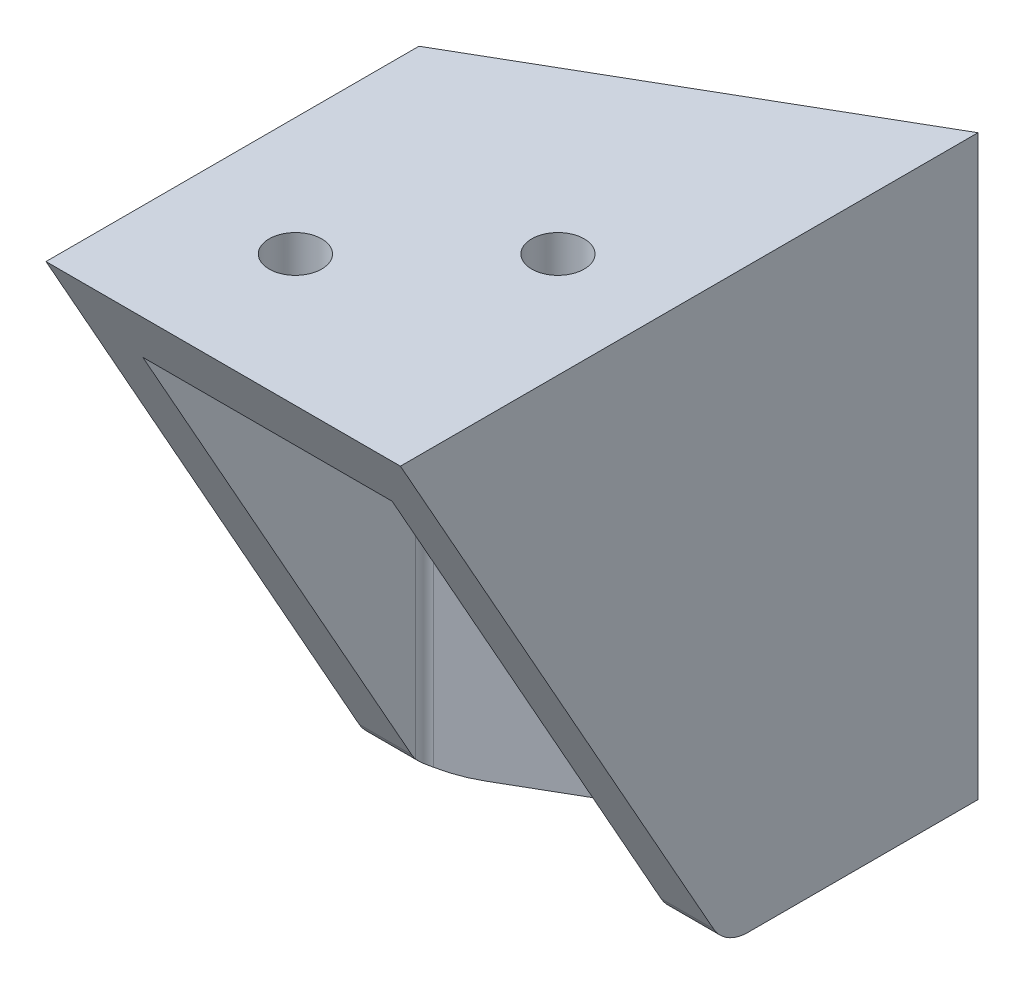
ISO-10303-21;
HEADER;
FILE_DESCRIPTION(('STEP AP214'),'2;1');
FILE_NAME('part.step','',(''),(''),'','','');
FILE_SCHEMA(('AUTOMOTIVE_DESIGN { 1 0 10303 214 1 1 1 1 }'));
ENDSEC;
DATA;
#1=APPLICATION_CONTEXT('core data for automotive mechanical design processes');
#2=APPLICATION_PROTOCOL_DEFINITION('international standard','automotive_design',2000,#1);
#3=PRODUCT_CONTEXT('',#1,'mechanical');
#4=PRODUCT('Part','Part','',(#3));
#5=PRODUCT_RELATED_PRODUCT_CATEGORY('part','',(#4));
#6=PRODUCT_DEFINITION_FORMATION('','',#4);
#7=PRODUCT_DEFINITION_CONTEXT('part definition',#1,'design');
#8=PRODUCT_DEFINITION('design','',#6,#7);
#9=PRODUCT_DEFINITION_SHAPE('','',#8);
#10=(LENGTH_UNIT() NAMED_UNIT(*) SI_UNIT(.MILLI.,.METRE.));
#11=(NAMED_UNIT(*) PLANE_ANGLE_UNIT() SI_UNIT($,.RADIAN.));
#12=(NAMED_UNIT(*) SI_UNIT($,.STERADIAN.) SOLID_ANGLE_UNIT());
#13=UNCERTAINTY_MEASURE_WITH_UNIT(LENGTH_MEASURE(1.E-05),#10,'distance_accuracy_value','');
#14=(GEOMETRIC_REPRESENTATION_CONTEXT(3) GLOBAL_UNCERTAINTY_ASSIGNED_CONTEXT((#13)) GLOBAL_UNIT_ASSIGNED_CONTEXT((#10,
#11,#12)) REPRESENTATION_CONTEXT('',''));
#15=CARTESIAN_POINT('',(0.,0.,0.));
#16=DIRECTION('',(0.,0.,1.));
#17=DIRECTION('',(1.,0.,0.));
#18=AXIS2_PLACEMENT_3D('',#15,#16,#17);
#19=CARTESIAN_POINT('',(0.,0.,0.));
#20=DIRECTION('',(0.,-1.,0.));
#21=DIRECTION('',(0.,0.,-1.));
#22=AXIS2_PLACEMENT_3D('',#19,#20,#21);
#23=PLANE('',#22);
#24=DIRECTION('',(0.,0.,-1.));
#25=VECTOR('',#24,1.);
#26=CARTESIAN_POINT('',(-9.5,0.,-2.72094380863878));
#27=LINE('',#26,#25);
#28=CARTESIAN_POINT('',(-9.5,0.,18.6288805365618));
#29=VERTEX_POINT('',#28);
#30=CARTESIAN_POINT('',(-9.5,0.,-2.14359353944915));
#31=VERTEX_POINT('',#30);
#32=EDGE_CURVE('E372',#29,#31,#27,.T.);
#33=ORIENTED_EDGE('',*,*,#32,.T.);
#34=CARTESIAN_POINT('',(-8.5,0.,-2.14359353944915));
#35=DIRECTION('',(0.,-1.,0.));
#36=DIRECTION('',(0.,0.,-1.));
#37=AXIS2_PLACEMENT_3D('',#34,#35,#36);
#38=CIRCLE('',#37,1.);
#39=CARTESIAN_POINT('',(-9.,0.,-3.00961894323359));
#40=VERTEX_POINT('',#39);
#41=EDGE_CURVE('E432',#31,#40,#38,.T.);
#42=ORIENTED_EDGE('',*,*,#41,.T.);
#43=DIRECTION('',(-0.866025403784442,0.,0.499999999999995));
#44=VECTOR('',#43,1.);
#45=CARTESIAN_POINT('',(-3.55320323027553,0.,-6.15432852445516));
#46=LINE('',#45,#44);
#47=CARTESIAN_POINT('',(8.00000000000001,0.,-12.8245735194571));
#48=VERTEX_POINT('',#47);
#49=EDGE_CURVE('E183',#48,#40,#46,.T.);
#50=ORIENTED_EDGE('',*,*,#49,.F.);
#51=CARTESIAN_POINT('',(8.5,0.,-11.9585481156727));
#52=DIRECTION('',(0.,-1.,0.));
#53=DIRECTION('',(0.,0.,-1.));
#54=AXIS2_PLACEMENT_3D('',#51,#52,#53);
#55=CIRCLE('',#54,1.);
#56=CARTESIAN_POINT('',(9.5,0.,-11.9585481156727));
#57=VERTEX_POINT('',#56);
#58=EDGE_CURVE('E202',#48,#57,#55,.T.);
#59=ORIENTED_EDGE('',*,*,#58,.T.);
#60=DIRECTION('',(0.,0.,1.));
#61=VECTOR('',#60,1.);
#62=CARTESIAN_POINT('',(9.5,0.,22.));
#63=LINE('',#62,#61);
#64=CARTESIAN_POINT('',(9.5,0.,18.6288805365618));
#65=VERTEX_POINT('',#64);
#66=EDGE_CURVE('E203',#57,#65,#63,.T.);
#67=ORIENTED_EDGE('',*,*,#66,.T.);
#68=DIRECTION('',(1.,0.,0.));
#69=VECTOR('',#68,1.);
#70=CARTESIAN_POINT('',(0.,0.,18.6288805365618));
#71=LINE('',#70,#69);
#72=EDGE_CURVE('E170',#29,#65,#71,.T.);
#73=ORIENTED_EDGE('',*,*,#72,.F.);
#74=EDGE_LOOP('',(#33,#42,#50,#59,#67,#73));
#75=FACE_BOUND('',#74,.T.);
#76=CARTESIAN_POINT('',(-4.5,0.,12.));
#77=DIRECTION('',(0.,-1.,0.));
#78=DIRECTION('',(0.,0.,-1.));
#79=AXIS2_PLACEMENT_3D('',#76,#77,#78);
#80=CIRCLE('',#79,2.);
#81=CARTESIAN_POINT('',(-4.5,0.,10.));
#82=VERTEX_POINT('',#81);
#83=EDGE_CURVE('E330',#82,#82,#80,.T.);
#84=ORIENTED_EDGE('',*,*,#83,.F.);
#85=EDGE_LOOP('',(#84));
#86=FACE_BOUND('',#85,.T.);
#87=CARTESIAN_POINT('',(5.5,0.,2.));
#88=DIRECTION('',(0.,-1.,0.));
#89=DIRECTION('',(0.,0.,-1.));
#90=AXIS2_PLACEMENT_3D('',#87,#88,#89);
#91=CIRCLE('',#90,2.);
#92=CARTESIAN_POINT('',(5.5,0.,0.));
#93=VERTEX_POINT('',#92);
#94=EDGE_CURVE('E332',#93,#93,#91,.T.);
#95=ORIENTED_EDGE('',*,*,#94,.F.);
#96=EDGE_LOOP('',(#95));
#97=FACE_BOUND('',#96,.T.);
#98=ADVANCED_FACE('F56',(#75,#86,#97),#23,.T.);
#99=CARTESIAN_POINT('',(13.5,-38.,-16.));
#100=DIRECTION('',(0.499999999999995,0.,0.866025403784442));
#101=DIRECTION('',(0.866025403784442,0.,-0.499999999999995));
#102=AXIS2_PLACEMENT_3D('',#99,#100,#101);
#103=PLANE('',#102);
#104=DIRECTION('',(0.,-1.,0.));
#105=VECTOR('',#104,1.);
#106=CARTESIAN_POINT('',(-9.,-37.9989340219212,-3.00961894323359));
#107=LINE('',#106,#105);
#108=CARTESIAN_POINT('',(-9.,-37.6165958429926,-3.00961894323359));
#109=VERTEX_POINT('',#108);
#110=EDGE_CURVE('E198',#40,#109,#107,.T.);
#111=ORIENTED_EDGE('',*,*,#110,.T.);
#112=CARTESIAN_POINT('',(-6.45829219159598,-35.,-4.47707463061701));
#113=DIRECTION('',(0.499999999999995,0.,0.866025403784442));
#114=DIRECTION('',(0.866025403784442,0.,-0.499999999999995));
#115=AXIS2_PLACEMENT_3D('',#112,#113,#114);
#116=ELLIPSE('',#115,6.00000000000006,3.);
#117=CARTESIAN_POINT('',(-6.45829219159598,-38.,-4.47707463061701));
#118=VERTEX_POINT('',#117);
#119=EDGE_CURVE('E409',#109,#118,#116,.T.);
#120=ORIENTED_EDGE('',*,*,#119,.T.);
#121=DIRECTION('',(0.866025403784441,0.,-0.499999999999995));
#122=VECTOR('',#121,1.);
#123=CARTESIAN_POINT('',(13.5,-38.,-16.));
#124=LINE('',#123,#122);
#125=CARTESIAN_POINT('',(8.00000000000001,-38.,-12.8245735194571));
#126=VERTEX_POINT('',#125);
#127=EDGE_CURVE('E287',#118,#126,#124,.T.);
#128=ORIENTED_EDGE('',*,*,#127,.T.);
#129=DIRECTION('',(0.,1.,0.));
#130=VECTOR('',#129,1.);
#131=CARTESIAN_POINT('',(8.00000000000001,-38.,-12.8245735194571));
#132=LINE('',#131,#130);
#133=EDGE_CURVE('E195',#126,#48,#132,.T.);
#134=ORIENTED_EDGE('',*,*,#133,.T.);
#135=ORIENTED_EDGE('',*,*,#49,.T.);
#136=EDGE_LOOP('',(#111,#120,#128,#134,#135));
#137=FACE_BOUND('',#136,.T.);
#138=CARTESIAN_POINT('',(1.22243186433548,-13.,-8.91154273188021));
#139=DIRECTION('',(0.499999999999995,0.,0.866025403784442));
#140=DIRECTION('',(0.866025403784442,0.,-0.499999999999995));
#141=AXIS2_PLACEMENT_3D('',#138,#139,#140);
#142=CIRCLE('',#141,2.05);
#143=CARTESIAN_POINT('',(2.99778394209358,-13.,-9.9365427318802));
#144=VERTEX_POINT('',#143);
#145=EDGE_CURVE('E341',#144,#144,#142,.T.);
#146=ORIENTED_EDGE('',*,*,#145,.F.);
#147=EDGE_LOOP('',(#146));
#148=FACE_BOUND('',#147,.T.);
#149=CARTESIAN_POINT('',(-3.10769515458673,-25.5,-6.41154273188023));
#150=DIRECTION('',(0.499999999999995,0.,0.866025403784442));
#151=DIRECTION('',(0.866025403784442,0.,-0.499999999999995));
#152=AXIS2_PLACEMENT_3D('',#149,#150,#151);
#153=CIRCLE('',#152,2.05);
#154=CARTESIAN_POINT('',(-1.33234307682862,-25.5,-7.43654273188022));
#155=VERTEX_POINT('',#154);
#156=EDGE_CURVE('E186',#155,#155,#153,.T.);
#157=ORIENTED_EDGE('',*,*,#156,.F.);
#158=EDGE_LOOP('',(#157));
#159=FACE_BOUND('',#158,.T.);
#160=ADVANCED_FACE('F236',(#137,#148,#159),#103,.T.);
#161=CARTESIAN_POINT('',(13.5,6.,22.));
#162=DIRECTION('',(-1.,0.,0.));
#163=DIRECTION('',(0.,0.,1.));
#164=AXIS2_PLACEMENT_3D('',#161,#162,#163);
#165=PLANE('',#164);
#166=DIRECTION('',(0.,-0.871816365902067,-0.48983285327274));
#167=VECTOR('',#166,1.);
#168=CARTESIAN_POINT('',(13.5,6.,22.));
#169=LINE('',#168,#167);
#170=CARTESIAN_POINT('',(13.5,6.,22.));
#171=VERTEX_POINT('',#170);
#172=CARTESIAN_POINT('',(13.5,-36.4694985598182,-1.8616255329108));
#173=VERTEX_POINT('',#172);
#174=EDGE_CURVE('E158',#171,#173,#169,.T.);
#175=ORIENTED_EDGE('',*,*,#174,.T.);
#176=CARTESIAN_POINT('',(13.5,-35.,-4.47707463061701));
#177=DIRECTION('',(-1.,0.,0.));
#178=DIRECTION('',(0.,0.,1.));
#179=AXIS2_PLACEMENT_3D('',#176,#177,#178);
#180=CIRCLE('',#179,3.);
#181=CARTESIAN_POINT('',(13.5,-38.,-4.47707463061701));
#182=VERTEX_POINT('',#181);
#183=EDGE_CURVE('E12',#173,#182,#180,.F.);
#184=ORIENTED_EDGE('',*,*,#183,.T.);
#185=DIRECTION('',(0.,0.,-1.));
#186=VECTOR('',#185,1.);
#187=CARTESIAN_POINT('',(13.5,-38.,22.));
#188=LINE('',#187,#186);
#189=CARTESIAN_POINT('',(13.5,-38.,-16.));
#190=VERTEX_POINT('',#189);
#191=EDGE_CURVE('E60',#182,#190,#188,.T.);
#192=ORIENTED_EDGE('',*,*,#191,.T.);
#193=DIRECTION('',(0.,0.,-1.));
#194=VECTOR('',#193,1.);
#195=CARTESIAN_POINT('',(13.5,-38.,-22.));
#196=LINE('',#195,#194);
#197=CARTESIAN_POINT('',(13.5,-38.,-22.));
#198=VERTEX_POINT('',#197);
#199=EDGE_CURVE('E347',#190,#198,#196,.T.);
#200=ORIENTED_EDGE('',*,*,#199,.T.);
#201=DIRECTION('',(0.,-1.,0.));
#202=VECTOR('',#201,1.);
#203=CARTESIAN_POINT('',(13.5,6.,-22.));
#204=LINE('',#203,#202);
#205=CARTESIAN_POINT('',(13.5,6.,-22.));
#206=VERTEX_POINT('',#205);
#207=EDGE_CURVE('E162',#206,#198,#204,.T.);
#208=ORIENTED_EDGE('',*,*,#207,.F.);
#209=DIRECTION('',(0.,0.,-1.));
#210=VECTOR('',#209,1.);
#211=CARTESIAN_POINT('',(13.5,6.,22.));
#212=LINE('',#211,#210);
#213=EDGE_CURVE('E176',#171,#206,#212,.T.);
#214=ORIENTED_EDGE('',*,*,#213,.F.);
#215=EDGE_LOOP('',(#175,#184,#192,#200,#208,#214));
#216=FACE_BOUND('',#215,.T.);
#217=ADVANCED_FACE('F240',(#216),#165,.F.);
#218=CARTESIAN_POINT('',(-13.5,6.,22.));
#219=DIRECTION('',(1.,0.,0.));
#220=DIRECTION('',(0.,0.,-1.));
#221=AXIS2_PLACEMENT_3D('',#218,#219,#220);
#222=PLANE('',#221);
#223=DIRECTION('',(0.,0.,1.));
#224=VECTOR('',#223,1.);
#225=CARTESIAN_POINT('',(-13.5,-38.,-0.411542731880311));
#226=LINE('',#225,#224);
#227=CARTESIAN_POINT('',(-13.5,-38.,-6.41154273188031));
#228=VERTEX_POINT('',#227);
#229=CARTESIAN_POINT('',(-13.5,-38.,-4.47707463061701));
#230=VERTEX_POINT('',#229);
#231=EDGE_CURVE('E263',#228,#230,#226,.T.);
#232=ORIENTED_EDGE('',*,*,#231,.T.);
#233=CARTESIAN_POINT('',(-13.5,-35.,-4.47707463061701));
#234=DIRECTION('',(1.,0.,0.));
#235=DIRECTION('',(0.,0.,-1.));
#236=AXIS2_PLACEMENT_3D('',#233,#234,#235);
#237=CIRCLE('',#236,3.);
#238=CARTESIAN_POINT('',(-13.5,-36.4694985598182,-1.8616255329108));
#239=VERTEX_POINT('',#238);
#240=EDGE_CURVE('E169',#230,#239,#237,.F.);
#241=ORIENTED_EDGE('',*,*,#240,.T.);
#242=DIRECTION('',(0.,-0.871816365902067,-0.48983285327274));
#243=VECTOR('',#242,1.);
#244=CARTESIAN_POINT('',(-13.5,6.,22.));
#245=LINE('',#244,#243);
#246=CARTESIAN_POINT('',(-13.5,6.,22.));
#247=VERTEX_POINT('',#246);
#248=EDGE_CURVE('E155',#247,#239,#245,.T.);
#249=ORIENTED_EDGE('',*,*,#248,.F.);
#250=DIRECTION('',(0.,0.,1.));
#251=VECTOR('',#250,1.);
#252=CARTESIAN_POINT('',(-13.5,6.,22.));
#253=LINE('',#252,#251);
#254=CARTESIAN_POINT('',(-13.5,6.,-6.41154273188031));
#255=VERTEX_POINT('',#254);
#256=EDGE_CURVE('E163',#255,#247,#253,.T.);
#257=ORIENTED_EDGE('',*,*,#256,.F.);
#258=DIRECTION('',(0.,1.,0.));
#259=VECTOR('',#258,1.);
#260=CARTESIAN_POINT('',(-13.5,0.,-6.41154273188031));
#261=LINE('',#260,#259);
#262=EDGE_CURVE('E178',#228,#255,#261,.T.);
#263=ORIENTED_EDGE('',*,*,#262,.F.);
#264=EDGE_LOOP('',(#232,#241,#249,#257,#263));
#265=FACE_BOUND('',#264,.T.);
#266=ADVANCED_FACE('F168',(#265),#222,.F.);
#267=CARTESIAN_POINT('',(0.,6.,0.));
#268=DIRECTION('',(0.,-1.,0.));
#269=DIRECTION('',(0.,0.,-1.));
#270=AXIS2_PLACEMENT_3D('',#267,#268,#269);
#271=PLANE('',#270);
#272=CARTESIAN_POINT('',(-4.5,6.,12.));
#273=DIRECTION('',(0.,-1.,0.));
#274=DIRECTION('',(0.,0.,-1.));
#275=AXIS2_PLACEMENT_3D('',#272,#273,#274);
#276=CIRCLE('',#275,2.);
#277=CARTESIAN_POINT('',(-4.5,6.,10.));
#278=VERTEX_POINT('',#277);
#279=EDGE_CURVE('E327',#278,#278,#276,.T.);
#280=ORIENTED_EDGE('',*,*,#279,.T.);
#281=EDGE_LOOP('',(#280));
#282=FACE_BOUND('',#281,.T.);
#283=CARTESIAN_POINT('',(5.5,6.,2.));
#284=DIRECTION('',(0.,-1.,0.));
#285=DIRECTION('',(0.,0.,-1.));
#286=AXIS2_PLACEMENT_3D('',#283,#284,#285);
#287=CIRCLE('',#286,2.);
#288=CARTESIAN_POINT('',(5.5,6.,0.));
#289=VERTEX_POINT('',#288);
#290=EDGE_CURVE('E336',#289,#289,#287,.T.);
#291=ORIENTED_EDGE('',*,*,#290,.T.);
#292=EDGE_LOOP('',(#291));
#293=FACE_BOUND('',#292,.T.);
#294=ORIENTED_EDGE('',*,*,#213,.T.);
#295=DIRECTION('',(0.866025403784441,0.,-0.499999999999995));
#296=VECTOR('',#295,1.);
#297=CARTESIAN_POINT('',(13.5,6.,-22.));
#298=LINE('',#297,#296);
#299=EDGE_CURVE('E175',#255,#206,#298,.T.);
#300=ORIENTED_EDGE('',*,*,#299,.F.);
#301=ORIENTED_EDGE('',*,*,#256,.T.);
#302=DIRECTION('',(1.,0.,0.));
#303=VECTOR('',#302,1.);
#304=CARTESIAN_POINT('',(-13.5,6.,22.));
#305=LINE('',#304,#303);
#306=EDGE_CURVE('E152',#247,#171,#305,.T.);
#307=ORIENTED_EDGE('',*,*,#306,.T.);
#308=EDGE_LOOP('',(#294,#300,#301,#307));
#309=FACE_BOUND('',#308,.T.);
#310=ADVANCED_FACE('F173',(#282,#293,#309),#271,.F.);
#311=CARTESIAN_POINT('',(13.5,0.,-22.));
#312=DIRECTION('',(0.499999999999995,0.,0.866025403784442));
#313=DIRECTION('',(0.866025403784442,0.,-0.499999999999995));
#314=AXIS2_PLACEMENT_3D('',#311,#312,#313);
#315=PLANE('',#314);
#316=CARTESIAN_POINT('',(-1.37564434701782,-13.,-13.4115427318802));
#317=DIRECTION('',(-0.499999999999995,0.,-0.866025403784442));
#318=DIRECTION('',(-0.866025403784442,0.,0.499999999999995));
#319=AXIS2_PLACEMENT_3D('',#316,#317,#318);
#320=CIRCLE('',#319,2.05);
#321=CARTESIAN_POINT('',(-3.15099642477593,-13.,-12.3865427318803));
#322=VERTEX_POINT('',#321);
#323=EDGE_CURVE('E359',#322,#322,#320,.T.);
#324=ORIENTED_EDGE('',*,*,#323,.F.);
#325=EDGE_LOOP('',(#324));
#326=FACE_BOUND('',#325,.T.);
#327=CARTESIAN_POINT('',(-5.70577136594003,-25.5,-10.9115427318803));
#328=DIRECTION('',(-0.499999999999995,0.,-0.866025403784442));
#329=DIRECTION('',(-0.866025403784442,0.,0.499999999999995));
#330=AXIS2_PLACEMENT_3D('',#327,#328,#329);
#331=CIRCLE('',#330,2.05);
#332=CARTESIAN_POINT('',(-7.48112344369814,-25.5,-9.88654273188028));
#333=VERTEX_POINT('',#332);
#334=EDGE_CURVE('E362',#333,#333,#331,.T.);
#335=ORIENTED_EDGE('',*,*,#334,.F.);
#336=EDGE_LOOP('',(#335));
#337=FACE_BOUND('',#336,.T.);
#338=ORIENTED_EDGE('',*,*,#299,.T.);
#339=ORIENTED_EDGE('',*,*,#207,.T.);
#340=DIRECTION('',(-0.866025403784441,0.,0.499999999999995));
#341=VECTOR('',#340,1.);
#342=CARTESIAN_POINT('',(-13.5,-38.,-6.41154273188031));
#343=LINE('',#342,#341);
#344=EDGE_CURVE('E344',#198,#228,#343,.T.);
#345=ORIENTED_EDGE('',*,*,#344,.T.);
#346=ORIENTED_EDGE('',*,*,#262,.T.);
#347=EDGE_LOOP('',(#338,#339,#345,#346));
#348=FACE_BOUND('',#347,.T.);
#349=ADVANCED_FACE('F233',(#326,#337,#348),#315,.F.);
#350=CARTESIAN_POINT('',(0.,-38.,0.));
#351=DIRECTION('',(0.,-1.,0.));
#352=DIRECTION('',(0.,0.,-1.));
#353=AXIS2_PLACEMENT_3D('',#350,#351,#352);
#354=PLANE('',#353);
#355=ORIENTED_EDGE('',*,*,#127,.F.);
#356=DIRECTION('',(-1.,0.,0.));
#357=VECTOR('',#356,1.);
#358=CARTESIAN_POINT('',(-13.5,-38.,-4.47707463061701));
#359=LINE('',#358,#357);
#360=EDGE_CURVE('E355',#118,#230,#359,.T.);
#361=ORIENTED_EDGE('',*,*,#360,.T.);
#362=ORIENTED_EDGE('',*,*,#231,.F.);
#363=ORIENTED_EDGE('',*,*,#344,.F.);
#364=ORIENTED_EDGE('',*,*,#199,.F.);
#365=ORIENTED_EDGE('',*,*,#191,.F.);
#366=DIRECTION('',(-1.,0.,0.));
#367=VECTOR('',#366,1.);
#368=CARTESIAN_POINT('',(9.5,-38.,-4.47707463061701));
#369=LINE('',#368,#367);
#370=CARTESIAN_POINT('',(9.5,-38.,-4.47707463061701));
#371=VERTEX_POINT('',#370);
#372=EDGE_CURVE('E378',#182,#371,#369,.T.);
#373=ORIENTED_EDGE('',*,*,#372,.T.);
#374=DIRECTION('',(0.,0.,-1.));
#375=VECTOR('',#374,1.);
#376=CARTESIAN_POINT('',(9.5,-38.,22.));
#377=LINE('',#376,#375);
#378=CARTESIAN_POINT('',(9.5,-38.,-11.9585481156727));
#379=VERTEX_POINT('',#378);
#380=EDGE_CURVE('E207',#371,#379,#377,.T.);
#381=ORIENTED_EDGE('',*,*,#380,.T.);
#382=CARTESIAN_POINT('',(8.5,-38.,-11.9585481156727));
#383=DIRECTION('',(0.,-1.,0.));
#384=DIRECTION('',(0.,0.,-1.));
#385=AXIS2_PLACEMENT_3D('',#382,#383,#384);
#386=CIRCLE('',#385,1.);
#387=EDGE_CURVE('E379',#379,#126,#386,.F.);
#388=ORIENTED_EDGE('',*,*,#387,.T.);
#389=EDGE_LOOP('',(#355,#361,#362,#363,#364,#365,#373,#381,#388));
#390=FACE_BOUND('',#389,.T.);
#391=ADVANCED_FACE('F222',(#390),#354,.T.);
#392=CARTESIAN_POINT('',(5.5,6.,2.));
#393=DIRECTION('',(0.,-1.,0.));
#394=DIRECTION('',(0.,0.,-1.));
#395=AXIS2_PLACEMENT_3D('',#392,#393,#394);
#396=CYLINDRICAL_SURFACE('',#395,2.);
#397=ORIENTED_EDGE('',*,*,#290,.F.);
#398=EDGE_LOOP('',(#397));
#399=FACE_BOUND('',#398,.T.);
#400=ORIENTED_EDGE('',*,*,#94,.T.);
#401=EDGE_LOOP('',(#400));
#402=FACE_BOUND('',#401,.T.);
#403=ADVANCED_FACE('F232',(#399,#402),#396,.F.);
#404=CARTESIAN_POINT('',(-4.5,6.,12.));
#405=DIRECTION('',(0.,-1.,0.));
#406=DIRECTION('',(0.,0.,-1.));
#407=AXIS2_PLACEMENT_3D('',#404,#405,#406);
#408=CYLINDRICAL_SURFACE('',#407,2.);
#409=ORIENTED_EDGE('',*,*,#279,.F.);
#410=EDGE_LOOP('',(#409));
#411=FACE_BOUND('',#410,.T.);
#412=ORIENTED_EDGE('',*,*,#83,.T.);
#413=EDGE_LOOP('',(#412));
#414=FACE_BOUND('',#413,.T.);
#415=ADVANCED_FACE('F316',(#411,#414),#408,.F.);
#416=CARTESIAN_POINT('',(13.3467875173175,-25.5,22.08845726812));
#417=DIRECTION('',(-0.499999999999995,0.,-0.866025403784441));
#418=DIRECTION('',(-0.866025403784442,0.,0.499999999999995));
#419=AXIS2_PLACEMENT_3D('',#416,#417,#418);
#420=CYLINDRICAL_SURFACE('',#419,2.05);
#421=ORIENTED_EDGE('',*,*,#156,.T.);
#422=EDGE_LOOP('',(#421));
#423=FACE_BOUND('',#422,.T.);
#424=ORIENTED_EDGE('',*,*,#334,.T.);
#425=EDGE_LOOP('',(#424));
#426=FACE_BOUND('',#425,.T.);
#427=ADVANCED_FACE('F313',(#423,#426),#420,.F.);
#428=CARTESIAN_POINT('',(17.6769145362397,-13.,19.58845726812));
#429=DIRECTION('',(-0.499999999999995,0.,-0.866025403784441));
#430=DIRECTION('',(-0.866025403784442,0.,0.499999999999995));
#431=AXIS2_PLACEMENT_3D('',#428,#429,#430);
#432=CYLINDRICAL_SURFACE('',#431,2.05);
#433=ORIENTED_EDGE('',*,*,#145,.T.);
#434=EDGE_LOOP('',(#433));
#435=FACE_BOUND('',#434,.T.);
#436=ORIENTED_EDGE('',*,*,#323,.T.);
#437=EDGE_LOOP('',(#436));
#438=FACE_BOUND('',#437,.T.);
#439=ADVANCED_FACE('F309',(#435,#438),#432,.F.);
#440=CARTESIAN_POINT('',(9.5,0.,0.));
#441=DIRECTION('',(1.,0.,0.));
#442=DIRECTION('',(0.,0.,-1.));
#443=AXIS2_PLACEMENT_3D('',#440,#441,#442);
#444=PLANE('',#443);
#445=ORIENTED_EDGE('',*,*,#380,.F.);
#446=CARTESIAN_POINT('',(9.5,-35.,-4.47707463061701));
#447=DIRECTION('',(1.,0.,0.));
#448=DIRECTION('',(0.,0.,-1.));
#449=AXIS2_PLACEMENT_3D('',#446,#447,#448);
#450=CIRCLE('',#449,3.);
#451=CARTESIAN_POINT('',(9.5,-36.4694985598182,-1.8616255329108));
#452=VERTEX_POINT('',#451);
#453=EDGE_CURVE('E66',#371,#452,#450,.F.);
#454=ORIENTED_EDGE('',*,*,#453,.T.);
#455=DIRECTION('',(0.,0.871816365902067,0.48983285327274));
#456=VECTOR('',#455,1.);
#457=CARTESIAN_POINT('',(9.5,-7.95535721200109,14.159137280565));
#458=LINE('',#457,#456);
#459=EDGE_CURVE('E373',#452,#65,#458,.T.);
#460=ORIENTED_EDGE('',*,*,#459,.T.);
#461=ORIENTED_EDGE('',*,*,#66,.F.);
#462=DIRECTION('',(0.,1.,0.));
#463=VECTOR('',#462,1.);
#464=CARTESIAN_POINT('',(9.5,0.,-11.9585481156727));
#465=LINE('',#464,#463);
#466=EDGE_CURVE('E381',#57,#379,#465,.F.);
#467=ORIENTED_EDGE('',*,*,#466,.T.);
#468=EDGE_LOOP('',(#445,#454,#460,#461,#467));
#469=FACE_BOUND('',#468,.T.);
#470=ADVANCED_FACE('F298',(#469),#444,.F.);
#471=CARTESIAN_POINT('',(-9.5,0.,0.));
#472=DIRECTION('',(1.,0.,0.));
#473=DIRECTION('',(0.,0.,-1.));
#474=AXIS2_PLACEMENT_3D('',#471,#472,#473);
#475=PLANE('',#474);
#476=DIRECTION('',(0.,0.871816365902067,0.48983285327274));
#477=VECTOR('',#476,1.);
#478=CARTESIAN_POINT('',(-9.5,-7.95535721200109,14.159137280565));
#479=LINE('',#478,#477);
#480=CARTESIAN_POINT('',(-9.5,-36.4694985598182,-1.8616255329108));
#481=VERTEX_POINT('',#480);
#482=EDGE_CURVE('E192',#481,#29,#479,.T.);
#483=ORIENTED_EDGE('',*,*,#482,.F.);
#484=CARTESIAN_POINT('',(-9.5,-35.,-4.47707463061701));
#485=DIRECTION('',(1.,0.,0.));
#486=DIRECTION('',(0.,0.,-1.));
#487=AXIS2_PLACEMENT_3D('',#484,#485,#486);
#488=CIRCLE('',#487,3.);
#489=CARTESIAN_POINT('',(-9.5,-36.885435227517,-2.14359353944915));
#490=VERTEX_POINT('',#489);
#491=EDGE_CURVE('E82',#481,#490,#488,.T.);
#492=ORIENTED_EDGE('',*,*,#491,.T.);
#493=DIRECTION('',(0.,-1.,0.));
#494=VECTOR('',#493,1.);
#495=CARTESIAN_POINT('',(-9.5,0.,-2.14359353944915));
#496=LINE('',#495,#494);
#497=EDGE_CURVE('E200',#490,#31,#496,.F.);
#498=ORIENTED_EDGE('',*,*,#497,.T.);
#499=ORIENTED_EDGE('',*,*,#32,.F.);
#500=EDGE_LOOP('',(#483,#492,#498,#499));
#501=FACE_BOUND('',#500,.T.);
#502=ADVANCED_FACE('F308',(#501),#475,.T.);
#503=CARTESIAN_POINT('',(13.5001,6.,22.));
#504=DIRECTION('',(0.,0.48983285327274,-0.871816365902067));
#505=DIRECTION('',(0.,0.871816365902067,0.48983285327274));
#506=AXIS2_PLACEMENT_3D('',#503,#504,#505);
#507=PLANE('',#506);
#508=ORIENTED_EDGE('',*,*,#248,.T.);
#509=DIRECTION('',(-1.,0.,0.));
#510=VECTOR('',#509,1.);
#511=CARTESIAN_POINT('',(-9.31607274857589,-36.4694985598182,-1.8616255329108));
#512=LINE('',#511,#510);
#513=EDGE_CURVE('E430',#239,#481,#512,.F.);
#514=ORIENTED_EDGE('',*,*,#513,.T.);
#515=ORIENTED_EDGE('',*,*,#482,.T.);
#516=ORIENTED_EDGE('',*,*,#72,.T.);
#517=ORIENTED_EDGE('',*,*,#459,.F.);
#518=DIRECTION('',(-1.,0.,0.));
#519=VECTOR('',#518,1.);
#520=CARTESIAN_POINT('',(13.5,-36.4694985598182,-1.8616255329108));
#521=LINE('',#520,#519);
#522=EDGE_CURVE('E377',#452,#173,#521,.F.);
#523=ORIENTED_EDGE('',*,*,#522,.T.);
#524=ORIENTED_EDGE('',*,*,#174,.F.);
#525=ORIENTED_EDGE('',*,*,#306,.F.);
#526=EDGE_LOOP('',(#508,#514,#515,#516,#517,#523,#524,#525));
#527=FACE_BOUND('',#526,.T.);
#528=ADVANCED_FACE('F154',(#527),#507,.F.);
#529=CARTESIAN_POINT('',(-8.5,-38.,-2.14359353944915));
#530=DIRECTION('',(0.,1.,0.));
#531=DIRECTION('',(0.,0.,1.));
#532=AXIS2_PLACEMENT_3D('',#529,#530,#531);
#533=CYLINDRICAL_SURFACE('',#532,1.);
#534=ORIENTED_EDGE('',*,*,#497,.F.);
#535=CARTESIAN_POINT('',(-9.5,-36.885435227517,-2.14359353944915));
#536=CARTESIAN_POINT('',(-9.49999682575666,-36.918155424405,-2.17002410435747));
#537=CARTESIAN_POINT('',(-9.49895124461281,-36.9503284801634,-2.19716399811032));
#538=CARTESIAN_POINT('',(-9.49441918072641,-37.0134711019606,-2.25273251195102));
#539=CARTESIAN_POINT('',(-9.49092790703186,-37.0444381796691,-2.28116355892225));
#540=CARTESIAN_POINT('',(-9.48110366364251,-37.1051890958264,-2.33932747729984));
#541=CARTESIAN_POINT('',(-9.47474658261602,-37.1349605106594,-2.3690694214456));
#542=CARTESIAN_POINT('',(-9.45882431125581,-37.1927944642392,-2.42929629454359));
#543=CARTESIAN_POINT('',(-9.44926179197762,-37.2208584028778,-2.4597805853579));
#544=CARTESIAN_POINT('',(-9.42092113958113,-37.2885678825535,-2.53640474067552));
#545=CARTESIAN_POINT('',(-9.39992479582543,-37.3270419179517,-2.58279955566347));
#546=CARTESIAN_POINT('',(-9.34903172404757,-37.398783709973,-2.67451698288377));
#547=CARTESIAN_POINT('',(-9.31916538687618,-37.4320686612949,-2.7198426948037));
#548=CARTESIAN_POINT('',(-9.25455026582719,-37.488987727049,-2.80163303926807));
#549=CARTESIAN_POINT('',(-9.22090812805392,-37.5133111057774,-2.83849093074585));
#550=CARTESIAN_POINT('',(-9.1468160402152,-37.5572319482728,-2.90791876206602));
#551=CARTESIAN_POINT('',(-9.10637744024889,-37.5768371607799,-2.9404956921087));
#552=CARTESIAN_POINT('',(-9.05282176739818,-37.5980371618329,-2.97698526363692));
#553=CARTESIAN_POINT('',(-9.04246897663876,-37.6019366131548,-2.98376151515246));
#554=CARTESIAN_POINT('',(-9.0214612413904,-37.6094659059573,-2.99695811234447));
#555=CARTESIAN_POINT('',(-9.0108066505273,-37.6130960462947,-3.00337885046697));
#556=CARTESIAN_POINT('',(-9.00000000000008,-37.6165958429927,-3.00961894323365));
#557=B_SPLINE_CURVE_WITH_KNOTS('',3,(#535,#536,#537,#538,#539,#540,#541,#542,#543,#544,#545,
#546,#547,#548,#549,#550,#551,#552,#553,#554,#555,#556),.UNSPECIFIED.,.F.,.F.,(4,2,2,2,2,2,2,2,
2,2,4),(0.,0.126192565973734,0.25263302874884,0.380157741401168,0.507576452223716,
0.698287228640398,0.888351975196522,1.05420446552539,1.21978268515984,1.25869562432756,
1.29756471468496),.UNSPECIFIED.);
#558=EDGE_CURVE('E74',#490,#109,#557,.T.);
#559=ORIENTED_EDGE('',*,*,#558,.T.);
#560=ORIENTED_EDGE('',*,*,#110,.F.);
#561=ORIENTED_EDGE('',*,*,#41,.F.);
#562=EDGE_LOOP('',(#534,#559,#560,#561));
#563=FACE_BOUND('',#562,.T.);
#564=ADVANCED_FACE('F257',(#563),#533,.F.);
#565=CARTESIAN_POINT('',(8.5,-38.,-11.9585481156727));
#566=DIRECTION('',(0.,1.,0.));
#567=DIRECTION('',(0.,0.,1.));
#568=AXIS2_PLACEMENT_3D('',#565,#566,#567);
#569=CYLINDRICAL_SURFACE('',#568,1.);
#570=ORIENTED_EDGE('',*,*,#387,.F.);
#571=ORIENTED_EDGE('',*,*,#466,.F.);
#572=ORIENTED_EDGE('',*,*,#58,.F.);
#573=ORIENTED_EDGE('',*,*,#133,.F.);
#574=EDGE_LOOP('',(#570,#571,#572,#573));
#575=FACE_BOUND('',#574,.T.);
#576=ADVANCED_FACE('F419',(#575),#569,.F.);
#577=CARTESIAN_POINT('',(0.,-35.,-4.47707463061701));
#578=DIRECTION('',(1.,0.,0.));
#579=DIRECTION('',(0.,0.,-1.));
#580=AXIS2_PLACEMENT_3D('',#577,#578,#579);
#581=CYLINDRICAL_SURFACE('',#580,3.);
#582=ORIENTED_EDGE('',*,*,#491,.F.);
#583=ORIENTED_EDGE('',*,*,#513,.F.);
#584=ORIENTED_EDGE('',*,*,#240,.F.);
#585=ORIENTED_EDGE('',*,*,#360,.F.);
#586=ORIENTED_EDGE('',*,*,#119,.F.);
#587=ORIENTED_EDGE('',*,*,#558,.F.);
#588=EDGE_LOOP('',(#582,#583,#584,#585,#586,#587));
#589=FACE_BOUND('',#588,.T.);
#590=ADVANCED_FACE('F416',(#589),#581,.T.);
#591=CARTESIAN_POINT('',(0.,-35.,-4.47707463061701));
#592=DIRECTION('',(1.,0.,0.));
#593=DIRECTION('',(0.,0.,-1.));
#594=AXIS2_PLACEMENT_3D('',#591,#592,#593);
#595=CYLINDRICAL_SURFACE('',#594,3.);
#596=ORIENTED_EDGE('',*,*,#183,.F.);
#597=ORIENTED_EDGE('',*,*,#522,.F.);
#598=ORIENTED_EDGE('',*,*,#453,.F.);
#599=ORIENTED_EDGE('',*,*,#372,.F.);
#600=EDGE_LOOP('',(#596,#597,#598,#599));
#601=FACE_BOUND('',#600,.T.);
#602=ADVANCED_FACE('F58',(#601),#595,.T.);
#603=CLOSED_SHELL('',(#98,#160,#217,#266,#310,#349,#391,#403,#415,#427,#439,#470,#502,#528,#564,
#576,#590,#602));
#604=MANIFOLD_SOLID_BREP('B2',#603);
#605=ADVANCED_BREP_SHAPE_REPRESENTATION('',(#18,#604),#14);
#606=SHAPE_DEFINITION_REPRESENTATION(#9,#605);
ENDSEC;
END-ISO-10303-21;
